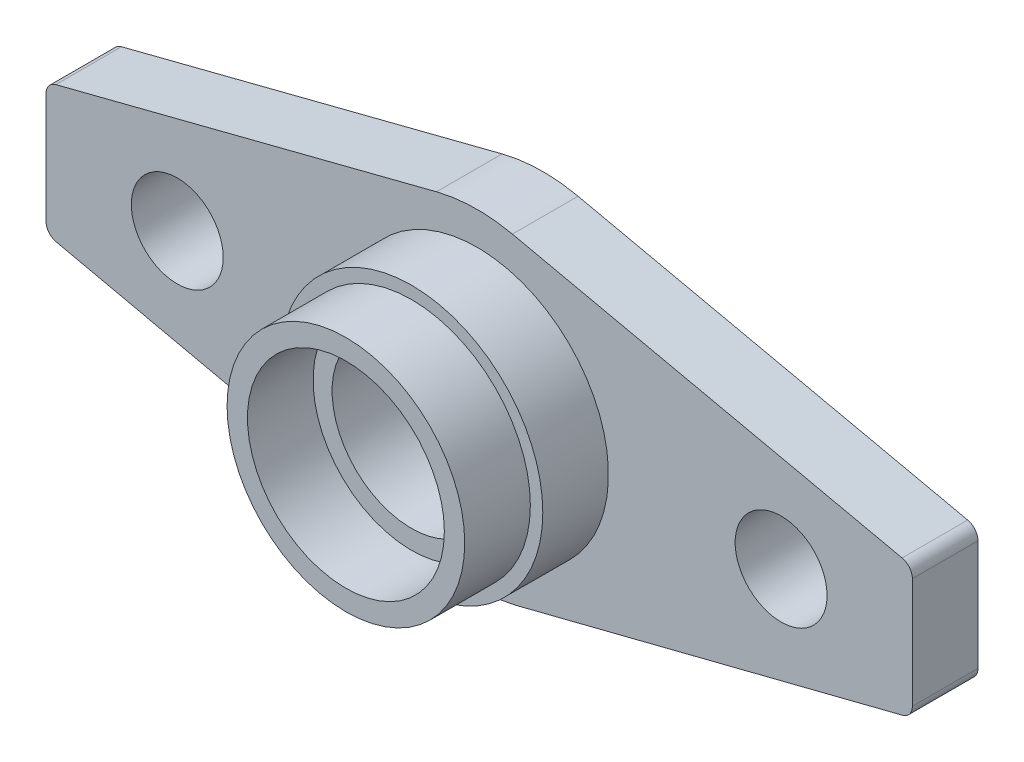
ISO-10303-21;
HEADER;
FILE_DESCRIPTION(('STEP AP214'),'2;1');
FILE_NAME('part.step','',(''),(''),'','','');
FILE_SCHEMA(('AUTOMOTIVE_DESIGN { 1 0 10303 214 1 1 1 1 }'));
ENDSEC;
DATA;
#1=APPLICATION_CONTEXT('core data for automotive mechanical design processes');
#2=APPLICATION_PROTOCOL_DEFINITION('international standard','automotive_design',2000,#1);
#3=PRODUCT_CONTEXT('',#1,'mechanical');
#4=PRODUCT('Part','Part','',(#3));
#5=PRODUCT_RELATED_PRODUCT_CATEGORY('part','',(#4));
#6=PRODUCT_DEFINITION_FORMATION('','',#4);
#7=PRODUCT_DEFINITION_CONTEXT('part definition',#1,'design');
#8=PRODUCT_DEFINITION('design','',#6,#7);
#9=PRODUCT_DEFINITION_SHAPE('','',#8);
#10=(LENGTH_UNIT() NAMED_UNIT(*) SI_UNIT(.MILLI.,.METRE.));
#11=(NAMED_UNIT(*) PLANE_ANGLE_UNIT() SI_UNIT($,.RADIAN.));
#12=(NAMED_UNIT(*) SI_UNIT($,.STERADIAN.) SOLID_ANGLE_UNIT());
#13=UNCERTAINTY_MEASURE_WITH_UNIT(LENGTH_MEASURE(1.E-05),#10,'distance_accuracy_value','');
#14=(GEOMETRIC_REPRESENTATION_CONTEXT(3) GLOBAL_UNCERTAINTY_ASSIGNED_CONTEXT((#13)) GLOBAL_UNIT_ASSIGNED_CONTEXT((#10,
#11,#12)) REPRESENTATION_CONTEXT('',''));
#15=CARTESIAN_POINT('',(0.,0.,0.));
#16=DIRECTION('',(0.,0.,1.));
#17=DIRECTION('',(1.,0.,0.));
#18=AXIS2_PLACEMENT_3D('',#15,#16,#17);
#19=CARTESIAN_POINT('',(0.,0.,9.99999999999999));
#20=DIRECTION('',(0.,0.,1.));
#21=DIRECTION('',(1.,0.,0.));
#22=AXIS2_PLACEMENT_3D('',#19,#20,#21);
#23=PLANE('',#22);
#24=CARTESIAN_POINT('',(0.,0.,9.99999999999999));
#25=DIRECTION('',(0.,0.,1.));
#26=DIRECTION('',(1.,0.,0.));
#27=AXIS2_PLACEMENT_3D('',#24,#25,#26);
#28=CIRCLE('',#27,6.05239911254278);
#29=CARTESIAN_POINT('',(6.05239911254278,0.,9.99999999999999));
#30=VERTEX_POINT('',#29);
#31=EDGE_CURVE('E382',#30,#30,#28,.T.);
#32=ORIENTED_EDGE('',*,*,#31,.F.);
#33=EDGE_LOOP('',(#32));
#34=FACE_BOUND('',#33,.T.);
#35=CARTESIAN_POINT('',(0.,0.,9.99999999999999));
#36=DIRECTION('',(0.,0.,1.));
#37=DIRECTION('',(1.,0.,0.));
#38=AXIS2_PLACEMENT_3D('',#35,#36,#37);
#39=CIRCLE('',#38,7.5);
#40=CARTESIAN_POINT('',(7.5,0.,9.99999999999999));
#41=VERTEX_POINT('',#40);
#42=EDGE_CURVE('E395',#41,#41,#39,.T.);
#43=ORIENTED_EDGE('',*,*,#42,.T.);
#44=EDGE_LOOP('',(#43));
#45=FACE_BOUND('',#44,.T.);
#46=ADVANCED_FACE('F45',(#34,#45),#23,.T.);
#47=CARTESIAN_POINT('',(32.1536278850666,4.71056307927455,5.));
#48=DIRECTION('',(0.,0.,-1.));
#49=DIRECTION('',(-1.,0.,0.));
#50=AXIS2_PLACEMENT_3D('',#47,#48,#49);
#51=PLANE('',#50);
#52=CARTESIAN_POINT('',(0.,0.,5.));
#53=DIRECTION('',(0.,0.,-1.));
#54=DIRECTION('',(-1.,0.,0.));
#55=AXIS2_PLACEMENT_3D('',#52,#53,#54);
#56=CIRCLE('',#55,10.);
#57=CARTESIAN_POINT('',(-10.,0.,5.));
#58=VERTEX_POINT('',#57);
#59=EDGE_CURVE('E49',#58,#58,#56,.F.);
#60=ORIENTED_EDGE('',*,*,#59,.F.);
#61=EDGE_LOOP('',(#60));
#62=FACE_BOUND('',#61,.T.);
#63=CARTESIAN_POINT('',(32.1536278850666,4.71056307927455,5.));
#64=DIRECTION('',(0.,0.,1.));
#65=DIRECTION('',(-1.,0.,0.));
#66=AXIS2_PLACEMENT_3D('',#63,#64,#65);
#67=CIRCLE('',#66,1.);
#68=CARTESIAN_POINT('',(33.1536278850666,4.71056307927455,5.));
#69=VERTEX_POINT('',#68);
#70=CARTESIAN_POINT('',(32.3681962311507,5.68727205581707,5.));
#71=VERTEX_POINT('',#70);
#72=EDGE_CURVE('E209',#69,#71,#67,.T.);
#73=ORIENTED_EDGE('',*,*,#72,.T.);
#74=DIRECTION('',(-0.976708976542515,0.214568346084114,0.));
#75=VECTOR('',#74,1.);
#76=CARTESIAN_POINT('',(2.68210432605143,12.2088622067814,5.));
#77=LINE('',#76,#75);
#78=CARTESIAN_POINT('',(2.68210432605143,12.2088622067814,5.));
#79=VERTEX_POINT('',#78);
#80=EDGE_CURVE('E120',#71,#79,#77,.T.);
#81=ORIENTED_EDGE('',*,*,#80,.T.);
#82=CARTESIAN_POINT('',(0.,0.,5.));
#83=DIRECTION('',(0.,0.,1.));
#84=DIRECTION('',(1.,0.,0.));
#85=AXIS2_PLACEMENT_3D('',#82,#83,#84);
#86=CIRCLE('',#85,12.5);
#87=CARTESIAN_POINT('',(-3.10175470256732,12.1090510679038,5.));
#88=VERTEX_POINT('',#87);
#89=EDGE_CURVE('E315',#79,#88,#86,.T.);
#90=ORIENTED_EDGE('',*,*,#89,.T.);
#91=DIRECTION('',(-0.968724085432302,-0.248140376205385,0.));
#92=VECTOR('',#91,1.);
#93=CARTESIAN_POINT('',(-32.0945124911388,4.68250522985204,5.));
#94=LINE('',#93,#92);
#95=CARTESIAN_POINT('',(-32.0945124911388,4.68250522985204,5.));
#96=VERTEX_POINT('',#95);
#97=EDGE_CURVE('E328',#88,#96,#94,.T.);
#98=ORIENTED_EDGE('',*,*,#97,.T.);
#99=CARTESIAN_POINT('',(-31.8463721149334,3.71378114441974,5.));
#100=DIRECTION('',(0.,0.,1.));
#101=DIRECTION('',(1.,0.,0.));
#102=AXIS2_PLACEMENT_3D('',#99,#100,#101);
#103=CIRCLE('',#102,1.);
#104=CARTESIAN_POINT('',(-32.8463721149334,3.71378114441974,5.));
#105=VERTEX_POINT('',#104);
#106=EDGE_CURVE('E324',#96,#105,#103,.T.);
#107=ORIENTED_EDGE('',*,*,#106,.T.);
#108=DIRECTION('',(0.,-1.,0.));
#109=VECTOR('',#108,1.);
#110=CARTESIAN_POINT('',(-32.8463721149334,-4.70777931106747,5.));
#111=LINE('',#110,#109);
#112=CARTESIAN_POINT('',(-32.8463721149334,-4.70777931106747,5.));
#113=VERTEX_POINT('',#112);
#114=EDGE_CURVE('E327',#105,#113,#111,.T.);
#115=ORIENTED_EDGE('',*,*,#114,.T.);
#116=CARTESIAN_POINT('',(-31.8463721149334,-4.70777931106747,5.));
#117=DIRECTION('',(0.,0.,1.));
#118=DIRECTION('',(-1.,0.,0.));
#119=AXIS2_PLACEMENT_3D('',#116,#117,#118);
#120=CIRCLE('',#119,1.);
#121=CARTESIAN_POINT('',(-32.0631433756029,-5.68400173477416,5.));
#122=VERTEX_POINT('',#121);
#123=EDGE_CURVE('E332',#113,#122,#120,.T.);
#124=ORIENTED_EDGE('',*,*,#123,.T.);
#125=DIRECTION('',(0.976222423706688,-0.216771260669488,0.));
#126=VECTOR('',#125,1.);
#127=CARTESIAN_POINT('',(-32.0631433756029,-5.68400173477416,5.));
#128=LINE('',#127,#126);
#129=CARTESIAN_POINT('',(-2.84596925561643,-12.1717073163992,5.));
#130=VERTEX_POINT('',#129);
#131=EDGE_CURVE('E339',#122,#130,#128,.T.);
#132=ORIENTED_EDGE('',*,*,#131,.T.);
#133=CARTESIAN_POINT('',(0.,0.,5.));
#134=DIRECTION('',(0.,0.,1.));
#135=DIRECTION('',(1.,0.,0.));
#136=AXIS2_PLACEMENT_3D('',#133,#134,#135);
#137=CIRCLE('',#136,12.5);
#138=CARTESIAN_POINT('',(2.93855105323997,-12.1496879674954,5.));
#139=VERTEX_POINT('',#138);
#140=EDGE_CURVE('E152',#130,#139,#137,.T.);
#141=ORIENTED_EDGE('',*,*,#140,.T.);
#142=DIRECTION('',(0.96930158559719,0.245874838401112,0.));
#143=VECTOR('',#142,1.);
#144=CARTESIAN_POINT('',(2.93855105323997,-12.1496879674954,5.));
#145=LINE('',#144,#143);
#146=CARTESIAN_POINT('',(32.3995027234677,-4.67656831238066,5.));
#147=VERTEX_POINT('',#146);
#148=EDGE_CURVE('E145',#139,#147,#145,.T.);
#149=ORIENTED_EDGE('',*,*,#148,.T.);
#150=CARTESIAN_POINT('',(32.1536278850666,-3.70726672678347,5.));
#151=DIRECTION('',(0.,0.,1.));
#152=DIRECTION('',(1.,0.,0.));
#153=AXIS2_PLACEMENT_3D('',#150,#151,#152);
#154=CIRCLE('',#153,1.);
#155=CARTESIAN_POINT('',(33.1536278850666,-3.70726672678347,5.));
#156=VERTEX_POINT('',#155);
#157=EDGE_CURVE('E150',#147,#156,#154,.T.);
#158=ORIENTED_EDGE('',*,*,#157,.T.);
#159=DIRECTION('',(0.,1.,0.));
#160=VECTOR('',#159,1.);
#161=CARTESIAN_POINT('',(33.1536278850666,-3.70726672678347,5.));
#162=LINE('',#161,#160);
#163=EDGE_CURVE('E64',#156,#69,#162,.T.);
#164=ORIENTED_EDGE('',*,*,#163,.T.);
#165=EDGE_LOOP('',(#73,#81,#90,#98,#107,#115,#124,#132,#141,#149,#158,#164));
#166=FACE_BOUND('',#165,.T.);
#167=CARTESIAN_POINT('',(-22.8463721149334,-0.345688892480017,5.));
#168=DIRECTION('',(0.,0.,1.));
#169=DIRECTION('',(1.,0.,0.));
#170=AXIS2_PLACEMENT_3D('',#167,#168,#169);
#171=CIRCLE('',#170,3.5);
#172=CARTESIAN_POINT('',(-19.3463721149334,-0.345688892480017,5.));
#173=VERTEX_POINT('',#172);
#174=EDGE_CURVE('E358',#173,#173,#171,.T.);
#175=ORIENTED_EDGE('',*,*,#174,.F.);
#176=EDGE_LOOP('',(#175));
#177=FACE_BOUND('',#176,.T.);
#178=CARTESIAN_POINT('',(23.1536278850666,0.350337985401691,5.));
#179=DIRECTION('',(0.,0.,1.));
#180=DIRECTION('',(1.,0.,0.));
#181=AXIS2_PLACEMENT_3D('',#178,#179,#180);
#182=CIRCLE('',#181,3.5);
#183=CARTESIAN_POINT('',(26.6536278850666,0.350337985401691,5.));
#184=VERTEX_POINT('',#183);
#185=EDGE_CURVE('E363',#184,#184,#182,.T.);
#186=ORIENTED_EDGE('',*,*,#185,.F.);
#187=EDGE_LOOP('',(#186));
#188=FACE_BOUND('',#187,.T.);
#189=ADVANCED_FACE('F147',(#62,#166,#177,#188),#51,.F.);
#190=CARTESIAN_POINT('',(32.1536278850666,4.71056307927455,0.));
#191=DIRECTION('',(0.,0.,-1.));
#192=DIRECTION('',(-1.,0.,0.));
#193=AXIS2_PLACEMENT_3D('',#190,#191,#192);
#194=PLANE('',#193);
#195=CARTESIAN_POINT('',(-22.8463721149334,-0.345688892480017,0.));
#196=DIRECTION('',(0.,0.,1.));
#197=DIRECTION('',(1.,0.,0.));
#198=AXIS2_PLACEMENT_3D('',#195,#196,#197);
#199=CIRCLE('',#198,3.5);
#200=CARTESIAN_POINT('',(-19.3463721149334,-0.345688892480017,0.));
#201=VERTEX_POINT('',#200);
#202=EDGE_CURVE('E359',#201,#201,#199,.T.);
#203=ORIENTED_EDGE('',*,*,#202,.T.);
#204=EDGE_LOOP('',(#203));
#205=FACE_BOUND('',#204,.T.);
#206=CARTESIAN_POINT('',(32.1536278850666,4.71056307927455,0.));
#207=DIRECTION('',(0.,0.,1.));
#208=DIRECTION('',(-1.,0.,0.));
#209=AXIS2_PLACEMENT_3D('',#206,#207,#208);
#210=CIRCLE('',#209,1.);
#211=CARTESIAN_POINT('',(33.1536278850666,4.71056307927455,0.));
#212=VERTEX_POINT('',#211);
#213=CARTESIAN_POINT('',(32.3681962311507,5.68727205581707,0.));
#214=VERTEX_POINT('',#213);
#215=EDGE_CURVE('E174',#212,#214,#210,.T.);
#216=ORIENTED_EDGE('',*,*,#215,.F.);
#217=DIRECTION('',(0.,1.,0.));
#218=VECTOR('',#217,1.);
#219=CARTESIAN_POINT('',(33.1536278850666,-3.70726672678347,0.));
#220=LINE('',#219,#218);
#221=CARTESIAN_POINT('',(33.1536278850666,-3.70726672678347,0.));
#222=VERTEX_POINT('',#221);
#223=EDGE_CURVE('E111',#222,#212,#220,.T.);
#224=ORIENTED_EDGE('',*,*,#223,.F.);
#225=CARTESIAN_POINT('',(32.1536278850666,-3.70726672678347,0.));
#226=DIRECTION('',(0.,0.,1.));
#227=DIRECTION('',(1.,0.,0.));
#228=AXIS2_PLACEMENT_3D('',#225,#226,#227);
#229=CIRCLE('',#228,1.);
#230=CARTESIAN_POINT('',(32.3995027234677,-4.67656831238066,0.));
#231=VERTEX_POINT('',#230);
#232=EDGE_CURVE('E105',#231,#222,#229,.T.);
#233=ORIENTED_EDGE('',*,*,#232,.F.);
#234=DIRECTION('',(0.96930158559719,0.245874838401112,0.));
#235=VECTOR('',#234,1.);
#236=CARTESIAN_POINT('',(2.93855105323997,-12.1496879674954,0.));
#237=LINE('',#236,#235);
#238=CARTESIAN_POINT('',(2.93855105323997,-12.1496879674954,0.));
#239=VERTEX_POINT('',#238);
#240=EDGE_CURVE('E161',#239,#231,#237,.T.);
#241=ORIENTED_EDGE('',*,*,#240,.F.);
#242=CARTESIAN_POINT('',(0.,0.,0.));
#243=DIRECTION('',(0.,0.,1.));
#244=DIRECTION('',(1.,0.,0.));
#245=AXIS2_PLACEMENT_3D('',#242,#243,#244);
#246=CIRCLE('',#245,12.5);
#247=CARTESIAN_POINT('',(-2.84596925561643,-12.1717073163992,0.));
#248=VERTEX_POINT('',#247);
#249=EDGE_CURVE('E200',#248,#239,#246,.T.);
#250=ORIENTED_EDGE('',*,*,#249,.F.);
#251=DIRECTION('',(0.976222423706688,-0.216771260669488,0.));
#252=VECTOR('',#251,1.);
#253=CARTESIAN_POINT('',(-32.0631433756029,-5.68400173477416,0.));
#254=LINE('',#253,#252);
#255=CARTESIAN_POINT('',(-32.0631433756029,-5.68400173477416,0.));
#256=VERTEX_POINT('',#255);
#257=EDGE_CURVE('E197',#256,#248,#254,.T.);
#258=ORIENTED_EDGE('',*,*,#257,.F.);
#259=CARTESIAN_POINT('',(-31.8463721149334,-4.70777931106747,0.));
#260=DIRECTION('',(0.,0.,1.));
#261=DIRECTION('',(-1.,0.,0.));
#262=AXIS2_PLACEMENT_3D('',#259,#260,#261);
#263=CIRCLE('',#262,1.);
#264=CARTESIAN_POINT('',(-32.8463721149334,-4.70777931106747,0.));
#265=VERTEX_POINT('',#264);
#266=EDGE_CURVE('E194',#265,#256,#263,.T.);
#267=ORIENTED_EDGE('',*,*,#266,.F.);
#268=DIRECTION('',(0.,-1.,0.));
#269=VECTOR('',#268,1.);
#270=CARTESIAN_POINT('',(-32.8463721149334,-4.70777931106747,0.));
#271=LINE('',#270,#269);
#272=CARTESIAN_POINT('',(-32.8463721149334,3.71378114441974,0.));
#273=VERTEX_POINT('',#272);
#274=EDGE_CURVE('E191',#273,#265,#271,.T.);
#275=ORIENTED_EDGE('',*,*,#274,.F.);
#276=CARTESIAN_POINT('',(-31.8463721149334,3.71378114441974,0.));
#277=DIRECTION('',(0.,0.,1.));
#278=DIRECTION('',(1.,0.,0.));
#279=AXIS2_PLACEMENT_3D('',#276,#277,#278);
#280=CIRCLE('',#279,1.);
#281=CARTESIAN_POINT('',(-32.0945124911388,4.68250522985204,0.));
#282=VERTEX_POINT('',#281);
#283=EDGE_CURVE('E188',#282,#273,#280,.T.);
#284=ORIENTED_EDGE('',*,*,#283,.F.);
#285=DIRECTION('',(-0.968724085432302,-0.248140376205385,0.));
#286=VECTOR('',#285,1.);
#287=CARTESIAN_POINT('',(-32.0945124911388,4.68250522985204,0.));
#288=LINE('',#287,#286);
#289=CARTESIAN_POINT('',(-3.10175470256732,12.1090510679038,0.));
#290=VERTEX_POINT('',#289);
#291=EDGE_CURVE('E185',#290,#282,#288,.T.);
#292=ORIENTED_EDGE('',*,*,#291,.F.);
#293=CARTESIAN_POINT('',(0.,0.,0.));
#294=DIRECTION('',(0.,0.,1.));
#295=DIRECTION('',(1.,0.,0.));
#296=AXIS2_PLACEMENT_3D('',#293,#294,#295);
#297=CIRCLE('',#296,12.5);
#298=CARTESIAN_POINT('',(2.68210432605143,12.2088622067814,0.));
#299=VERTEX_POINT('',#298);
#300=EDGE_CURVE('E182',#299,#290,#297,.T.);
#301=ORIENTED_EDGE('',*,*,#300,.F.);
#302=DIRECTION('',(-0.976708976542515,0.214568346084114,0.));
#303=VECTOR('',#302,1.);
#304=CARTESIAN_POINT('',(2.68210432605143,12.2088622067814,0.));
#305=LINE('',#304,#303);
#306=EDGE_CURVE('E178',#214,#299,#305,.T.);
#307=ORIENTED_EDGE('',*,*,#306,.F.);
#308=EDGE_LOOP('',(#216,#224,#233,#241,#250,#258,#267,#275,#284,#292,#301,#307));
#309=FACE_BOUND('',#308,.T.);
#310=CARTESIAN_POINT('',(0.,0.,0.));
#311=DIRECTION('',(0.,0.,1.));
#312=DIRECTION('',(1.,0.,0.));
#313=AXIS2_PLACEMENT_3D('',#310,#311,#312);
#314=CIRCLE('',#313,7.5);
#315=CARTESIAN_POINT('',(7.5,0.,0.));
#316=VERTEX_POINT('',#315);
#317=EDGE_CURVE('E179',#316,#316,#314,.T.);
#318=ORIENTED_EDGE('',*,*,#317,.T.);
#319=EDGE_LOOP('',(#318));
#320=FACE_BOUND('',#319,.T.);
#321=CARTESIAN_POINT('',(23.1536278850666,0.350337985401691,0.));
#322=DIRECTION('',(0.,0.,1.));
#323=DIRECTION('',(1.,0.,0.));
#324=AXIS2_PLACEMENT_3D('',#321,#322,#323);
#325=CIRCLE('',#324,3.5);
#326=CARTESIAN_POINT('',(26.6536278850666,0.350337985401691,0.));
#327=VERTEX_POINT('',#326);
#328=EDGE_CURVE('E367',#327,#327,#325,.T.);
#329=ORIENTED_EDGE('',*,*,#328,.T.);
#330=EDGE_LOOP('',(#329));
#331=FACE_BOUND('',#330,.T.);
#332=ADVANCED_FACE('F253',(#205,#309,#320,#331),#194,.T.);
#333=CARTESIAN_POINT('',(32.1536278850666,4.71056307927455,5.));
#334=DIRECTION('',(0.,0.,-1.));
#335=DIRECTION('',(-1.,0.,0.));
#336=AXIS2_PLACEMENT_3D('',#333,#334,#335);
#337=CYLINDRICAL_SURFACE('',#336,1.);
#338=ORIENTED_EDGE('',*,*,#215,.T.);
#339=DIRECTION('',(0.,0.,-1.));
#340=VECTOR('',#339,1.);
#341=CARTESIAN_POINT('',(32.3681962311507,5.68727205581707,5.));
#342=LINE('',#341,#340);
#343=EDGE_CURVE('E243',#71,#214,#342,.T.);
#344=ORIENTED_EDGE('',*,*,#343,.F.);
#345=ORIENTED_EDGE('',*,*,#72,.F.);
#346=DIRECTION('',(0.,0.,-1.));
#347=VECTOR('',#346,1.);
#348=CARTESIAN_POINT('',(33.1536278850666,4.71056307927455,5.));
#349=LINE('',#348,#347);
#350=EDGE_CURVE('E170',#69,#212,#349,.T.);
#351=ORIENTED_EDGE('',*,*,#350,.T.);
#352=EDGE_LOOP('',(#338,#344,#345,#351));
#353=FACE_BOUND('',#352,.T.);
#354=ADVANCED_FACE('F47',(#353),#337,.T.);
#355=CARTESIAN_POINT('',(2.68210432605143,12.2088622067814,5.));
#356=DIRECTION('',(-0.214568346084114,-0.976708976542515,0.));
#357=DIRECTION('',(0.976708976542516,-0.214568346084114,0.));
#358=AXIS2_PLACEMENT_3D('',#355,#356,#357);
#359=PLANE('',#358);
#360=ORIENTED_EDGE('',*,*,#306,.T.);
#361=DIRECTION('',(0.,0.,-1.));
#362=VECTOR('',#361,1.);
#363=CARTESIAN_POINT('',(2.68210432605143,12.2088622067814,5.));
#364=LINE('',#363,#362);
#365=EDGE_CURVE('E240',#79,#299,#364,.T.);
#366=ORIENTED_EDGE('',*,*,#365,.F.);
#367=ORIENTED_EDGE('',*,*,#80,.F.);
#368=ORIENTED_EDGE('',*,*,#343,.T.);
#369=EDGE_LOOP('',(#360,#366,#367,#368));
#370=FACE_BOUND('',#369,.T.);
#371=ADVANCED_FACE('F303',(#370),#359,.F.);
#372=CARTESIAN_POINT('',(0.,0.,5.));
#373=DIRECTION('',(0.,0.,-1.));
#374=DIRECTION('',(-1.,0.,0.));
#375=AXIS2_PLACEMENT_3D('',#372,#373,#374);
#376=CYLINDRICAL_SURFACE('',#375,12.5);
#377=ORIENTED_EDGE('',*,*,#300,.T.);
#378=DIRECTION('',(0.,0.,-1.));
#379=VECTOR('',#378,1.);
#380=CARTESIAN_POINT('',(-3.10175470256732,12.1090510679038,5.));
#381=LINE('',#380,#379);
#382=EDGE_CURVE('E236',#88,#290,#381,.T.);
#383=ORIENTED_EDGE('',*,*,#382,.F.);
#384=ORIENTED_EDGE('',*,*,#89,.F.);
#385=ORIENTED_EDGE('',*,*,#365,.T.);
#386=EDGE_LOOP('',(#377,#383,#384,#385));
#387=FACE_BOUND('',#386,.T.);
#388=ADVANCED_FACE('F300',(#387),#376,.T.);
#389=CARTESIAN_POINT('',(-32.0945124911388,4.68250522985204,5.));
#390=DIRECTION('',(0.248140376205385,-0.968724085432302,0.));
#391=DIRECTION('',(0.968724085432302,0.248140376205385,0.));
#392=AXIS2_PLACEMENT_3D('',#389,#390,#391);
#393=PLANE('',#392);
#394=ORIENTED_EDGE('',*,*,#291,.T.);
#395=DIRECTION('',(0.,0.,-1.));
#396=VECTOR('',#395,1.);
#397=CARTESIAN_POINT('',(-32.0945124911388,4.68250522985204,5.));
#398=LINE('',#397,#396);
#399=EDGE_CURVE('E232',#96,#282,#398,.T.);
#400=ORIENTED_EDGE('',*,*,#399,.F.);
#401=ORIENTED_EDGE('',*,*,#97,.F.);
#402=ORIENTED_EDGE('',*,*,#382,.T.);
#403=EDGE_LOOP('',(#394,#400,#401,#402));
#404=FACE_BOUND('',#403,.T.);
#405=ADVANCED_FACE('F296',(#404),#393,.F.);
#406=CARTESIAN_POINT('',(-31.8463721149334,3.71378114441974,5.));
#407=DIRECTION('',(0.,0.,-1.));
#408=DIRECTION('',(-1.,0.,0.));
#409=AXIS2_PLACEMENT_3D('',#406,#407,#408);
#410=CYLINDRICAL_SURFACE('',#409,1.);
#411=ORIENTED_EDGE('',*,*,#283,.T.);
#412=DIRECTION('',(0.,0.,-1.));
#413=VECTOR('',#412,1.);
#414=CARTESIAN_POINT('',(-32.8463721149334,3.71378114441974,5.));
#415=LINE('',#414,#413);
#416=EDGE_CURVE('E228',#105,#273,#415,.T.);
#417=ORIENTED_EDGE('',*,*,#416,.F.);
#418=ORIENTED_EDGE('',*,*,#106,.F.);
#419=ORIENTED_EDGE('',*,*,#399,.T.);
#420=EDGE_LOOP('',(#411,#417,#418,#419));
#421=FACE_BOUND('',#420,.T.);
#422=ADVANCED_FACE('F292',(#421),#410,.T.);
#423=CARTESIAN_POINT('',(-32.8463721149334,-4.70777931106747,5.));
#424=DIRECTION('',(1.,0.,0.));
#425=DIRECTION('',(0.,0.,-1.));
#426=AXIS2_PLACEMENT_3D('',#423,#424,#425);
#427=PLANE('',#426);
#428=ORIENTED_EDGE('',*,*,#274,.T.);
#429=DIRECTION('',(0.,0.,-1.));
#430=VECTOR('',#429,1.);
#431=CARTESIAN_POINT('',(-32.8463721149334,-4.70777931106747,5.));
#432=LINE('',#431,#430);
#433=EDGE_CURVE('E224',#113,#265,#432,.T.);
#434=ORIENTED_EDGE('',*,*,#433,.F.);
#435=ORIENTED_EDGE('',*,*,#114,.F.);
#436=ORIENTED_EDGE('',*,*,#416,.T.);
#437=EDGE_LOOP('',(#428,#434,#435,#436));
#438=FACE_BOUND('',#437,.T.);
#439=ADVANCED_FACE('F288',(#438),#427,.F.);
#440=CARTESIAN_POINT('',(-31.8463721149334,-4.70777931106747,5.));
#441=DIRECTION('',(0.,0.,-1.));
#442=DIRECTION('',(-1.,0.,0.));
#443=AXIS2_PLACEMENT_3D('',#440,#441,#442);
#444=CYLINDRICAL_SURFACE('',#443,1.);
#445=ORIENTED_EDGE('',*,*,#266,.T.);
#446=DIRECTION('',(0.,0.,-1.));
#447=VECTOR('',#446,1.);
#448=CARTESIAN_POINT('',(-32.0631433756029,-5.68400173477416,5.));
#449=LINE('',#448,#447);
#450=EDGE_CURVE('E220',#122,#256,#449,.T.);
#451=ORIENTED_EDGE('',*,*,#450,.F.);
#452=ORIENTED_EDGE('',*,*,#123,.F.);
#453=ORIENTED_EDGE('',*,*,#433,.T.);
#454=EDGE_LOOP('',(#445,#451,#452,#453));
#455=FACE_BOUND('',#454,.T.);
#456=ADVANCED_FACE('F284',(#455),#444,.T.);
#457=CARTESIAN_POINT('',(-32.0631433756029,-5.68400173477416,5.));
#458=DIRECTION('',(0.216771260669488,0.976222423706688,0.));
#459=DIRECTION('',(-0.976222423706688,0.216771260669488,0.));
#460=AXIS2_PLACEMENT_3D('',#457,#458,#459);
#461=PLANE('',#460);
#462=ORIENTED_EDGE('',*,*,#257,.T.);
#463=DIRECTION('',(0.,0.,-1.));
#464=VECTOR('',#463,1.);
#465=CARTESIAN_POINT('',(-2.84596925561643,-12.1717073163992,5.));
#466=LINE('',#465,#464);
#467=EDGE_CURVE('E216',#130,#248,#466,.T.);
#468=ORIENTED_EDGE('',*,*,#467,.F.);
#469=ORIENTED_EDGE('',*,*,#131,.F.);
#470=ORIENTED_EDGE('',*,*,#450,.T.);
#471=EDGE_LOOP('',(#462,#468,#469,#470));
#472=FACE_BOUND('',#471,.T.);
#473=ADVANCED_FACE('F280',(#472),#461,.F.);
#474=CARTESIAN_POINT('',(0.,0.,5.));
#475=DIRECTION('',(0.,0.,-1.));
#476=DIRECTION('',(-1.,0.,0.));
#477=AXIS2_PLACEMENT_3D('',#474,#475,#476);
#478=CYLINDRICAL_SURFACE('',#477,12.5);
#479=ORIENTED_EDGE('',*,*,#249,.T.);
#480=DIRECTION('',(0.,0.,-1.));
#481=VECTOR('',#480,1.);
#482=CARTESIAN_POINT('',(2.93855105323997,-12.1496879674954,5.));
#483=LINE('',#482,#481);
#484=EDGE_CURVE('E163',#139,#239,#483,.T.);
#485=ORIENTED_EDGE('',*,*,#484,.F.);
#486=ORIENTED_EDGE('',*,*,#140,.F.);
#487=ORIENTED_EDGE('',*,*,#467,.T.);
#488=EDGE_LOOP('',(#479,#485,#486,#487));
#489=FACE_BOUND('',#488,.T.);
#490=ADVANCED_FACE('F277',(#489),#478,.T.);
#491=CARTESIAN_POINT('',(2.93855105323997,-12.1496879674954,5.));
#492=DIRECTION('',(-0.245874838401112,0.96930158559719,0.));
#493=DIRECTION('',(-0.96930158559719,-0.245874838401112,0.));
#494=AXIS2_PLACEMENT_3D('',#491,#492,#493);
#495=PLANE('',#494);
#496=ORIENTED_EDGE('',*,*,#240,.T.);
#497=DIRECTION('',(0.,0.,-1.));
#498=VECTOR('',#497,1.);
#499=CARTESIAN_POINT('',(32.3995027234677,-4.67656831238066,5.));
#500=LINE('',#499,#498);
#501=EDGE_CURVE('E158',#147,#231,#500,.T.);
#502=ORIENTED_EDGE('',*,*,#501,.F.);
#503=ORIENTED_EDGE('',*,*,#148,.F.);
#504=ORIENTED_EDGE('',*,*,#484,.T.);
#505=EDGE_LOOP('',(#496,#502,#503,#504));
#506=FACE_BOUND('',#505,.T.);
#507=ADVANCED_FACE('F159',(#506),#495,.F.);
#508=CARTESIAN_POINT('',(32.1536278850666,-3.70726672678347,5.));
#509=DIRECTION('',(0.,0.,-1.));
#510=DIRECTION('',(-1.,0.,0.));
#511=AXIS2_PLACEMENT_3D('',#508,#509,#510);
#512=CYLINDRICAL_SURFACE('',#511,1.);
#513=ORIENTED_EDGE('',*,*,#232,.T.);
#514=DIRECTION('',(0.,0.,-1.));
#515=VECTOR('',#514,1.);
#516=CARTESIAN_POINT('',(33.1536278850666,-3.70726672678347,5.));
#517=LINE('',#516,#515);
#518=EDGE_CURVE('E164',#156,#222,#517,.T.);
#519=ORIENTED_EDGE('',*,*,#518,.F.);
#520=ORIENTED_EDGE('',*,*,#157,.F.);
#521=ORIENTED_EDGE('',*,*,#501,.T.);
#522=EDGE_LOOP('',(#513,#519,#520,#521));
#523=FACE_BOUND('',#522,.T.);
#524=ADVANCED_FACE('F166',(#523),#512,.T.);
#525=CARTESIAN_POINT('',(33.1536278850666,-3.70726672678347,5.));
#526=DIRECTION('',(-1.,0.,0.));
#527=DIRECTION('',(0.,0.,1.));
#528=AXIS2_PLACEMENT_3D('',#525,#526,#527);
#529=PLANE('',#528);
#530=ORIENTED_EDGE('',*,*,#223,.T.);
#531=ORIENTED_EDGE('',*,*,#350,.F.);
#532=ORIENTED_EDGE('',*,*,#163,.F.);
#533=ORIENTED_EDGE('',*,*,#518,.T.);
#534=EDGE_LOOP('',(#530,#531,#532,#533));
#535=FACE_BOUND('',#534,.T.);
#536=ADVANCED_FACE('F270',(#535),#529,.F.);
#537=CARTESIAN_POINT('',(0.,0.,5.));
#538=DIRECTION('',(0.,0.,-1.));
#539=DIRECTION('',(-1.,0.,0.));
#540=AXIS2_PLACEMENT_3D('',#537,#538,#539);
#541=CYLINDRICAL_SURFACE('',#540,7.5);
#542=CARTESIAN_POINT('',(0.,0.,5.));
#543=DIRECTION('',(0.,0.,1.));
#544=DIRECTION('',(1.,0.,0.));
#545=AXIS2_PLACEMENT_3D('',#542,#543,#544);
#546=CIRCLE('',#545,7.5);
#547=CARTESIAN_POINT('',(7.5,0.,5.));
#548=VERTEX_POINT('',#547);
#549=EDGE_CURVE('E371',#548,#548,#546,.T.);
#550=ORIENTED_EDGE('',*,*,#549,.T.);
#551=EDGE_LOOP('',(#550));
#552=FACE_BOUND('',#551,.T.);
#553=ORIENTED_EDGE('',*,*,#317,.F.);
#554=EDGE_LOOP('',(#553));
#555=FACE_BOUND('',#554,.T.);
#556=ADVANCED_FACE('F267',(#552,#555),#541,.F.);
#557=CARTESIAN_POINT('',(-22.8463721149334,-0.345688892480017,5.));
#558=DIRECTION('',(0.,0.,-1.));
#559=DIRECTION('',(-1.,0.,0.));
#560=AXIS2_PLACEMENT_3D('',#557,#558,#559);
#561=CYLINDRICAL_SURFACE('',#560,3.5);
#562=ORIENTED_EDGE('',*,*,#174,.T.);
#563=EDGE_LOOP('',(#562));
#564=FACE_BOUND('',#563,.T.);
#565=ORIENTED_EDGE('',*,*,#202,.F.);
#566=EDGE_LOOP('',(#565));
#567=FACE_BOUND('',#566,.T.);
#568=ADVANCED_FACE('F431',(#564,#567),#561,.F.);
#569=CARTESIAN_POINT('',(23.1536278850666,0.350337985401691,5.));
#570=DIRECTION('',(0.,0.,-1.));
#571=DIRECTION('',(-1.,0.,0.));
#572=AXIS2_PLACEMENT_3D('',#569,#570,#571);
#573=CYLINDRICAL_SURFACE('',#572,3.5);
#574=ORIENTED_EDGE('',*,*,#185,.T.);
#575=EDGE_LOOP('',(#574));
#576=FACE_BOUND('',#575,.T.);
#577=ORIENTED_EDGE('',*,*,#328,.F.);
#578=EDGE_LOOP('',(#577));
#579=FACE_BOUND('',#578,.T.);
#580=ADVANCED_FACE('F426',(#576,#579),#573,.F.);
#581=CARTESIAN_POINT('',(0.,0.,5.));
#582=DIRECTION('',(0.,0.,1.));
#583=DIRECTION('',(1.,0.,0.));
#584=AXIS2_PLACEMENT_3D('',#581,#582,#583);
#585=PLANE('',#584);
#586=CARTESIAN_POINT('',(0.,0.,5.));
#587=DIRECTION('',(0.,0.,1.));
#588=DIRECTION('',(1.,0.,0.));
#589=AXIS2_PLACEMENT_3D('',#586,#587,#588);
#590=CIRCLE('',#589,6.05239911254278);
#591=CARTESIAN_POINT('',(6.05239911254278,0.,5.));
#592=VERTEX_POINT('',#591);
#593=EDGE_CURVE('E383',#592,#592,#590,.T.);
#594=ORIENTED_EDGE('',*,*,#593,.T.);
#595=EDGE_LOOP('',(#594));
#596=FACE_BOUND('',#595,.T.);
#597=ORIENTED_EDGE('',*,*,#549,.F.);
#598=EDGE_LOOP('',(#597));
#599=FACE_BOUND('',#598,.T.);
#600=ADVANCED_FACE('F423',(#596,#599),#585,.F.);
#601=CARTESIAN_POINT('',(0.,0.,9.99999999999999));
#602=DIRECTION('',(0.,0.,1.));
#603=DIRECTION('',(1.,0.,0.));
#604=AXIS2_PLACEMENT_3D('',#601,#602,#603);
#605=CIRCLE('',#604,9.05239911254278);
#606=CARTESIAN_POINT('',(9.05239911254278,0.,9.99999999999999));
#607=VERTEX_POINT('',#606);
#608=EDGE_CURVE('E11',#607,#607,#605,.T.);
#609=ORIENTED_EDGE('',*,*,#608,.F.);
#610=EDGE_LOOP('',(#609));
#611=FACE_BOUND('',#610,.T.);
#612=CARTESIAN_POINT('',(0.,0.,9.99999999999999));
#613=DIRECTION('',(0.,0.,1.));
#614=DIRECTION('',(1.,0.,0.));
#615=AXIS2_PLACEMENT_3D('',#612,#613,#614);
#616=CIRCLE('',#615,10.);
#617=CARTESIAN_POINT('',(10.,0.,9.99999999999999));
#618=VERTEX_POINT('',#617);
#619=EDGE_CURVE('E378',#618,#618,#616,.T.);
#620=ORIENTED_EDGE('',*,*,#619,.T.);
#621=EDGE_LOOP('',(#620));
#622=FACE_BOUND('',#621,.T.);
#623=ADVANCED_FACE('F265',(#611,#622),#23,.T.);
#624=CARTESIAN_POINT('',(0.,0.,9.99999999999999));
#625=DIRECTION('',(0.,0.,-1.));
#626=DIRECTION('',(-1.,0.,0.));
#627=AXIS2_PLACEMENT_3D('',#624,#625,#626);
#628=CYLINDRICAL_SURFACE('',#627,10.);
#629=ORIENTED_EDGE('',*,*,#619,.F.);
#630=EDGE_LOOP('',(#629));
#631=FACE_BOUND('',#630,.T.);
#632=ORIENTED_EDGE('',*,*,#59,.T.);
#633=EDGE_LOOP('',(#632));
#634=FACE_BOUND('',#633,.T.);
#635=ADVANCED_FACE('F250',(#631,#634),#628,.T.);
#636=CARTESIAN_POINT('',(0.,0.,9.99999999999999));
#637=DIRECTION('',(0.,0.,-1.));
#638=DIRECTION('',(-1.,0.,0.));
#639=AXIS2_PLACEMENT_3D('',#636,#637,#638);
#640=CYLINDRICAL_SURFACE('',#639,6.05239911254278);
#641=ORIENTED_EDGE('',*,*,#31,.T.);
#642=EDGE_LOOP('',(#641));
#643=FACE_BOUND('',#642,.T.);
#644=ORIENTED_EDGE('',*,*,#593,.F.);
#645=EDGE_LOOP('',(#644));
#646=FACE_BOUND('',#645,.T.);
#647=ADVANCED_FACE('F409',(#643,#646),#640,.F.);
#648=CARTESIAN_POINT('',(0.,0.,15.));
#649=DIRECTION('',(0.,0.,1.));
#650=DIRECTION('',(1.,0.,0.));
#651=AXIS2_PLACEMENT_3D('',#648,#649,#650);
#652=PLANE('',#651);
#653=CARTESIAN_POINT('',(0.,0.,15.));
#654=DIRECTION('',(0.,0.,1.));
#655=DIRECTION('',(1.,0.,0.));
#656=AXIS2_PLACEMENT_3D('',#653,#654,#655);
#657=CIRCLE('',#656,9.05239911254278);
#658=CARTESIAN_POINT('',(9.05239911254278,0.,15.));
#659=VERTEX_POINT('',#658);
#660=EDGE_CURVE('E387',#659,#659,#657,.T.);
#661=ORIENTED_EDGE('',*,*,#660,.T.);
#662=EDGE_LOOP('',(#661));
#663=FACE_BOUND('',#662,.T.);
#664=CARTESIAN_POINT('',(0.,0.,15.));
#665=DIRECTION('',(0.,0.,1.));
#666=DIRECTION('',(1.,0.,0.));
#667=AXIS2_PLACEMENT_3D('',#664,#665,#666);
#668=CIRCLE('',#667,7.5);
#669=CARTESIAN_POINT('',(7.5,0.,15.));
#670=VERTEX_POINT('',#669);
#671=EDGE_CURVE('E394',#670,#670,#668,.T.);
#672=ORIENTED_EDGE('',*,*,#671,.F.);
#673=EDGE_LOOP('',(#672));
#674=FACE_BOUND('',#673,.T.);
#675=ADVANCED_FACE('F406',(#663,#674),#652,.T.);
#676=CARTESIAN_POINT('',(0.,0.,15.));
#677=DIRECTION('',(0.,0.,-1.));
#678=DIRECTION('',(-1.,0.,0.));
#679=AXIS2_PLACEMENT_3D('',#676,#677,#678);
#680=CYLINDRICAL_SURFACE('',#679,9.05239911254278);
#681=ORIENTED_EDGE('',*,*,#660,.F.);
#682=EDGE_LOOP('',(#681));
#683=FACE_BOUND('',#682,.T.);
#684=ORIENTED_EDGE('',*,*,#608,.T.);
#685=EDGE_LOOP('',(#684));
#686=FACE_BOUND('',#685,.T.);
#687=ADVANCED_FACE('F408',(#683,#686),#680,.T.);
#688=CARTESIAN_POINT('',(0.,0.,15.));
#689=DIRECTION('',(0.,0.,-1.));
#690=DIRECTION('',(-1.,0.,0.));
#691=AXIS2_PLACEMENT_3D('',#688,#689,#690);
#692=CYLINDRICAL_SURFACE('',#691,7.5);
#693=ORIENTED_EDGE('',*,*,#671,.T.);
#694=EDGE_LOOP('',(#693));
#695=FACE_BOUND('',#694,.T.);
#696=ORIENTED_EDGE('',*,*,#42,.F.);
#697=EDGE_LOOP('',(#696));
#698=FACE_BOUND('',#697,.T.);
#699=ADVANCED_FACE('F403',(#695,#698),#692,.F.);
#700=CLOSED_SHELL('',(#46,#189,#332,#354,#371,#388,#405,#422,#439,#456,#473,#490,#507,#524,#536,
#556,#568,#580,#600,#623,#635,#647,#675,#687,#699));
#701=MANIFOLD_SOLID_BREP('B2',#700);
#702=ADVANCED_BREP_SHAPE_REPRESENTATION('',(#18,#701),#14);
#703=SHAPE_DEFINITION_REPRESENTATION(#9,#702);
ENDSEC;
END-ISO-10303-21;
